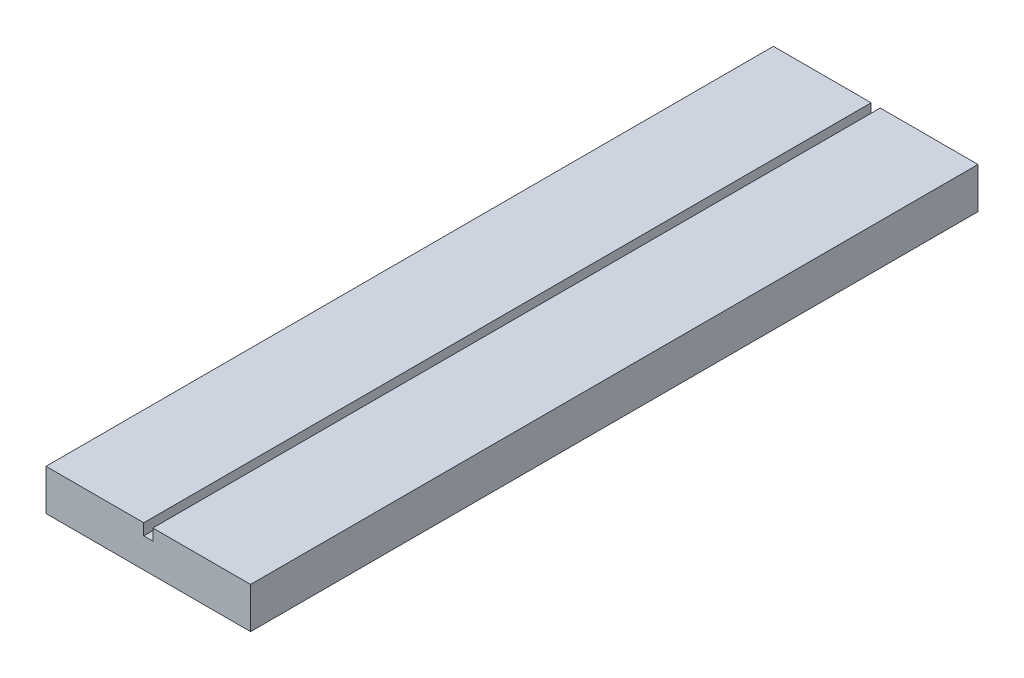
ISO-10303-21;
HEADER;
FILE_DESCRIPTION(('STEP AP214'),'2;1');
FILE_NAME('part.step','',(''),(''),'','','');
FILE_SCHEMA(('AUTOMOTIVE_DESIGN { 1 0 10303 214 1 1 1 1 }'));
ENDSEC;
DATA;
#1=APPLICATION_CONTEXT('core data for automotive mechanical design processes');
#2=APPLICATION_PROTOCOL_DEFINITION('international standard','automotive_design',2000,#1);
#3=PRODUCT_CONTEXT('',#1,'mechanical');
#4=PRODUCT('Part','Part','',(#3));
#5=PRODUCT_RELATED_PRODUCT_CATEGORY('part','',(#4));
#6=PRODUCT_DEFINITION_FORMATION('','',#4);
#7=PRODUCT_DEFINITION_CONTEXT('part definition',#1,'design');
#8=PRODUCT_DEFINITION('design','',#6,#7);
#9=PRODUCT_DEFINITION_SHAPE('','',#8);
#10=(LENGTH_UNIT() NAMED_UNIT(*) SI_UNIT(.MILLI.,.METRE.));
#11=(NAMED_UNIT(*) PLANE_ANGLE_UNIT() SI_UNIT($,.RADIAN.));
#12=(NAMED_UNIT(*) SI_UNIT($,.STERADIAN.) SOLID_ANGLE_UNIT());
#13=UNCERTAINTY_MEASURE_WITH_UNIT(LENGTH_MEASURE(1.E-05),#10,'distance_accuracy_value','');
#14=(GEOMETRIC_REPRESENTATION_CONTEXT(3) GLOBAL_UNCERTAINTY_ASSIGNED_CONTEXT((#13)) GLOBAL_UNIT_ASSIGNED_CONTEXT((#10,
#11,#12)) REPRESENTATION_CONTEXT('',''));
#15=CARTESIAN_POINT('',(0.,0.,0.));
#16=DIRECTION('',(0.,0.,1.));
#17=DIRECTION('',(1.,0.,0.));
#18=AXIS2_PLACEMENT_3D('',#15,#16,#17);
#19=CARTESIAN_POINT('',(0.,9.,0.));
#20=DIRECTION('',(0.,1.,0.));
#21=DIRECTION('',(0.,0.,1.));
#22=AXIS2_PLACEMENT_3D('',#19,#20,#21);
#23=PLANE('',#22);
#24=DIRECTION('',(1.,0.,0.));
#25=VECTOR('',#24,1.);
#26=CARTESIAN_POINT('',(-22.5,9.,80.0000000000001));
#27=LINE('',#26,#25);
#28=CARTESIAN_POINT('',(-22.5,9.,80.0000000000001));
#29=VERTEX_POINT('',#28);
#30=CARTESIAN_POINT('',(-1.,9.,80.0000000000001));
#31=VERTEX_POINT('',#30);
#32=EDGE_CURVE('E119',#29,#31,#27,.T.);
#33=ORIENTED_EDGE('',*,*,#32,.T.);
#34=DIRECTION('',(0.,0.,-1.));
#35=VECTOR('',#34,1.);
#36=CARTESIAN_POINT('',(-1.,9.,488.063992559982));
#37=LINE('',#36,#35);
#38=CARTESIAN_POINT('',(-1.00000000000001,9.,-79.9999999999999));
#39=VERTEX_POINT('',#38);
#40=EDGE_CURVE('E183',#31,#39,#37,.T.);
#41=ORIENTED_EDGE('',*,*,#40,.T.);
#42=DIRECTION('',(-1.,0.,0.));
#43=VECTOR('',#42,1.);
#44=CARTESIAN_POINT('',(-22.5,9.,-79.9999999999999));
#45=LINE('',#44,#43);
#46=CARTESIAN_POINT('',(-22.5,9.,-79.9999999999999));
#47=VERTEX_POINT('',#46);
#48=EDGE_CURVE('E173',#39,#47,#45,.T.);
#49=ORIENTED_EDGE('',*,*,#48,.T.);
#50=DIRECTION('',(0.,0.,1.));
#51=VECTOR('',#50,1.);
#52=CARTESIAN_POINT('',(-22.5,9.,-79.9999999999999));
#53=LINE('',#52,#51);
#54=EDGE_CURVE('E120',#47,#29,#53,.T.);
#55=ORIENTED_EDGE('',*,*,#54,.T.);
#56=EDGE_LOOP('',(#33,#41,#49,#55));
#57=FACE_BOUND('',#56,.T.);
#58=ADVANCED_FACE('F43',(#57),#23,.T.);
#59=CARTESIAN_POINT('',(-22.5,9.,-79.9999999999999));
#60=DIRECTION('',(0.,0.,1.));
#61=DIRECTION('',(1.,0.,0.));
#62=AXIS2_PLACEMENT_3D('',#59,#60,#61);
#63=PLANE('',#62);
#64=DIRECTION('',(0.,1.,0.));
#65=VECTOR('',#64,1.);
#66=CARTESIAN_POINT('',(-1.,9.,-79.9999999999999));
#67=LINE('',#66,#65);
#68=CARTESIAN_POINT('',(-0.999999999999997,6.5,-79.9999999999999));
#69=VERTEX_POINT('',#68);
#70=EDGE_CURVE('E59',#69,#39,#67,.T.);
#71=ORIENTED_EDGE('',*,*,#70,.F.);
#72=DIRECTION('',(-1.,0.,0.));
#73=VECTOR('',#72,1.);
#74=CARTESIAN_POINT('',(-22.5,6.5,-79.9999999999999));
#75=LINE('',#74,#73);
#76=CARTESIAN_POINT('',(1.,6.5,-79.9999999999999));
#77=VERTEX_POINT('',#76);
#78=EDGE_CURVE('E63',#77,#69,#75,.T.);
#79=ORIENTED_EDGE('',*,*,#78,.F.);
#80=DIRECTION('',(0.,-1.,0.));
#81=VECTOR('',#80,1.);
#82=CARTESIAN_POINT('',(1.,9.,-79.9999999999999));
#83=LINE('',#82,#81);
#84=CARTESIAN_POINT('',(0.999999999999994,9.,-79.9999999999999));
#85=VERTEX_POINT('',#84);
#86=EDGE_CURVE('E180',#85,#77,#83,.T.);
#87=ORIENTED_EDGE('',*,*,#86,.F.);
#88=CARTESIAN_POINT('',(22.5,9.,-79.9999999999999));
#89=VERTEX_POINT('',#88);
#90=EDGE_CURVE('E126',#89,#85,#45,.T.);
#91=ORIENTED_EDGE('',*,*,#90,.F.);
#92=DIRECTION('',(0.,-1.,0.));
#93=VECTOR('',#92,1.);
#94=CARTESIAN_POINT('',(22.5,9.,-79.9999999999999));
#95=LINE('',#94,#93);
#96=CARTESIAN_POINT('',(22.5,0.,-79.9999999999999));
#97=VERTEX_POINT('',#96);
#98=EDGE_CURVE('E136',#89,#97,#95,.T.);
#99=ORIENTED_EDGE('',*,*,#98,.T.);
#100=DIRECTION('',(-1.,0.,0.));
#101=VECTOR('',#100,1.);
#102=CARTESIAN_POINT('',(-22.5,0.,-79.9999999999999));
#103=LINE('',#102,#101);
#104=CARTESIAN_POINT('',(-22.5,0.,-79.9999999999999));
#105=VERTEX_POINT('',#104);
#106=EDGE_CURVE('E160',#97,#105,#103,.T.);
#107=ORIENTED_EDGE('',*,*,#106,.T.);
#108=DIRECTION('',(0.,-1.,0.));
#109=VECTOR('',#108,1.);
#110=CARTESIAN_POINT('',(-22.5,9.,-79.9999999999999));
#111=LINE('',#110,#109);
#112=EDGE_CURVE('E141',#47,#105,#111,.T.);
#113=ORIENTED_EDGE('',*,*,#112,.F.);
#114=ORIENTED_EDGE('',*,*,#48,.F.);
#115=EDGE_LOOP('',(#71,#79,#87,#91,#99,#107,#113,#114));
#116=FACE_BOUND('',#115,.T.);
#117=ADVANCED_FACE('F199',(#116),#63,.F.);
#118=CARTESIAN_POINT('',(-22.5,9.,80.0000000000001));
#119=DIRECTION('',(0.,0.,-1.));
#120=DIRECTION('',(-1.,0.,0.));
#121=AXIS2_PLACEMENT_3D('',#118,#119,#120);
#122=PLANE('',#121);
#123=DIRECTION('',(0.,-1.,0.));
#124=VECTOR('',#123,1.);
#125=CARTESIAN_POINT('',(-1.,9.,80.0000000000001));
#126=LINE('',#125,#124);
#127=CARTESIAN_POINT('',(-0.999999999999997,6.5,80.0000000000001));
#128=VERTEX_POINT('',#127);
#129=EDGE_CURVE('E11',#31,#128,#126,.T.);
#130=ORIENTED_EDGE('',*,*,#129,.F.);
#131=ORIENTED_EDGE('',*,*,#32,.F.);
#132=DIRECTION('',(0.,-1.,0.));
#133=VECTOR('',#132,1.);
#134=CARTESIAN_POINT('',(-22.5,9.,80.0000000000001));
#135=LINE('',#134,#133);
#136=CARTESIAN_POINT('',(-22.5,0.,80.0000000000001));
#137=VERTEX_POINT('',#136);
#138=EDGE_CURVE('E147',#29,#137,#135,.T.);
#139=ORIENTED_EDGE('',*,*,#138,.T.);
#140=DIRECTION('',(1.,0.,0.));
#141=VECTOR('',#140,1.);
#142=CARTESIAN_POINT('',(-22.5,0.,80.0000000000001));
#143=LINE('',#142,#141);
#144=CARTESIAN_POINT('',(22.5,0.,80.0000000000001));
#145=VERTEX_POINT('',#144);
#146=EDGE_CURVE('E153',#137,#145,#143,.T.);
#147=ORIENTED_EDGE('',*,*,#146,.T.);
#148=DIRECTION('',(0.,-1.,0.));
#149=VECTOR('',#148,1.);
#150=CARTESIAN_POINT('',(22.5,9.,80.0000000000001));
#151=LINE('',#150,#149);
#152=CARTESIAN_POINT('',(22.5,9.,80.0000000000001));
#153=VERTEX_POINT('',#152);
#154=EDGE_CURVE('E114',#153,#145,#151,.T.);
#155=ORIENTED_EDGE('',*,*,#154,.F.);
#156=CARTESIAN_POINT('',(1.,9.,80.0000000000001));
#157=VERTEX_POINT('',#156);
#158=EDGE_CURVE('E107',#157,#153,#27,.T.);
#159=ORIENTED_EDGE('',*,*,#158,.F.);
#160=DIRECTION('',(0.,1.,0.));
#161=VECTOR('',#160,1.);
#162=CARTESIAN_POINT('',(1.,9.,80.0000000000001));
#163=LINE('',#162,#161);
#164=CARTESIAN_POINT('',(1.,6.5,80.0000000000001));
#165=VERTEX_POINT('',#164);
#166=EDGE_CURVE('E111',#165,#157,#163,.T.);
#167=ORIENTED_EDGE('',*,*,#166,.F.);
#168=DIRECTION('',(1.,0.,0.));
#169=VECTOR('',#168,1.);
#170=CARTESIAN_POINT('',(-22.5,6.5,80.0000000000001));
#171=LINE('',#170,#169);
#172=EDGE_CURVE('E52',#128,#165,#171,.T.);
#173=ORIENTED_EDGE('',*,*,#172,.F.);
#174=EDGE_LOOP('',(#130,#131,#139,#147,#155,#159,#167,#173));
#175=FACE_BOUND('',#174,.T.);
#176=ADVANCED_FACE('F109',(#175),#122,.F.);
#177=CARTESIAN_POINT('',(22.5,9.,-79.9999999999999));
#178=DIRECTION('',(-1.,0.,0.));
#179=DIRECTION('',(0.,0.,1.));
#180=AXIS2_PLACEMENT_3D('',#177,#178,#179);
#181=PLANE('',#180);
#182=DIRECTION('',(0.,0.,-1.));
#183=VECTOR('',#182,1.);
#184=CARTESIAN_POINT('',(22.5,0.,-79.9999999999999));
#185=LINE('',#184,#183);
#186=EDGE_CURVE('E163',#145,#97,#185,.T.);
#187=ORIENTED_EDGE('',*,*,#186,.T.);
#188=ORIENTED_EDGE('',*,*,#98,.F.);
#189=DIRECTION('',(0.,0.,-1.));
#190=VECTOR('',#189,1.);
#191=CARTESIAN_POINT('',(22.5,9.,-79.9999999999999));
#192=LINE('',#191,#190);
#193=EDGE_CURVE('E156',#153,#89,#192,.T.);
#194=ORIENTED_EDGE('',*,*,#193,.F.);
#195=ORIENTED_EDGE('',*,*,#154,.T.);
#196=EDGE_LOOP('',(#187,#188,#194,#195));
#197=FACE_BOUND('',#196,.T.);
#198=ADVANCED_FACE('F45',(#197),#181,.F.);
#199=CARTESIAN_POINT('',(-22.5,9.,-79.9999999999999));
#200=DIRECTION('',(1.,0.,0.));
#201=DIRECTION('',(0.,0.,-1.));
#202=AXIS2_PLACEMENT_3D('',#199,#200,#201);
#203=PLANE('',#202);
#204=DIRECTION('',(0.,0.,1.));
#205=VECTOR('',#204,1.);
#206=CARTESIAN_POINT('',(-22.5,0.,-79.9999999999999));
#207=LINE('',#206,#205);
#208=EDGE_CURVE('E157',#105,#137,#207,.T.);
#209=ORIENTED_EDGE('',*,*,#208,.T.);
#210=ORIENTED_EDGE('',*,*,#138,.F.);
#211=ORIENTED_EDGE('',*,*,#54,.F.);
#212=ORIENTED_EDGE('',*,*,#112,.T.);
#213=EDGE_LOOP('',(#209,#210,#211,#212));
#214=FACE_BOUND('',#213,.T.);
#215=ADVANCED_FACE('F205',(#214),#203,.F.);
#216=DIRECTION('',(0.,0.,-1.));
#217=VECTOR('',#216,1.);
#218=CARTESIAN_POINT('',(1.,9.,488.063992559982));
#219=LINE('',#218,#217);
#220=EDGE_CURVE('E124',#157,#85,#219,.T.);
#221=ORIENTED_EDGE('',*,*,#220,.F.);
#222=ORIENTED_EDGE('',*,*,#158,.T.);
#223=ORIENTED_EDGE('',*,*,#193,.T.);
#224=ORIENTED_EDGE('',*,*,#90,.T.);
#225=EDGE_LOOP('',(#221,#222,#223,#224));
#226=FACE_BOUND('',#225,.T.);
#227=ADVANCED_FACE('F125',(#226),#23,.T.);
#228=CARTESIAN_POINT('',(0.,0.,0.));
#229=DIRECTION('',(0.,1.,0.));
#230=DIRECTION('',(0.,0.,1.));
#231=AXIS2_PLACEMENT_3D('',#228,#229,#230);
#232=PLANE('',#231);
#233=ORIENTED_EDGE('',*,*,#186,.F.);
#234=ORIENTED_EDGE('',*,*,#146,.F.);
#235=ORIENTED_EDGE('',*,*,#208,.F.);
#236=ORIENTED_EDGE('',*,*,#106,.F.);
#237=EDGE_LOOP('',(#233,#234,#235,#236));
#238=FACE_BOUND('',#237,.T.);
#239=ADVANCED_FACE('F209',(#238),#232,.F.);
#240=CARTESIAN_POINT('',(-1.,6.5,488.063992559982));
#241=DIRECTION('',(1.,0.,0.));
#242=DIRECTION('',(0.,0.,-1.));
#243=AXIS2_PLACEMENT_3D('',#240,#241,#242);
#244=PLANE('',#243);
#245=DIRECTION('',(0.,0.,-1.));
#246=VECTOR('',#245,1.);
#247=CARTESIAN_POINT('',(-1.,6.5,488.063992559982));
#248=LINE('',#247,#246);
#249=EDGE_CURVE('E129',#128,#69,#248,.T.);
#250=ORIENTED_EDGE('',*,*,#249,.T.);
#251=ORIENTED_EDGE('',*,*,#70,.T.);
#252=ORIENTED_EDGE('',*,*,#40,.F.);
#253=ORIENTED_EDGE('',*,*,#129,.T.);
#254=EDGE_LOOP('',(#250,#251,#252,#253));
#255=FACE_BOUND('',#254,.T.);
#256=ADVANCED_FACE('F196',(#255),#244,.T.);
#257=CARTESIAN_POINT('',(-1.,6.5,488.063992559982));
#258=DIRECTION('',(0.,1.,0.));
#259=DIRECTION('',(0.,0.,1.));
#260=AXIS2_PLACEMENT_3D('',#257,#258,#259);
#261=PLANE('',#260);
#262=DIRECTION('',(0.,0.,-1.));
#263=VECTOR('',#262,1.);
#264=CARTESIAN_POINT('',(1.,6.5,488.063992559982));
#265=LINE('',#264,#263);
#266=EDGE_CURVE('E130',#165,#77,#265,.T.);
#267=ORIENTED_EDGE('',*,*,#266,.T.);
#268=ORIENTED_EDGE('',*,*,#78,.T.);
#269=ORIENTED_EDGE('',*,*,#249,.F.);
#270=ORIENTED_EDGE('',*,*,#172,.T.);
#271=EDGE_LOOP('',(#267,#268,#269,#270));
#272=FACE_BOUND('',#271,.T.);
#273=ADVANCED_FACE('F191',(#272),#261,.T.);
#274=CARTESIAN_POINT('',(1.,6.5,488.063992559982));
#275=DIRECTION('',(-1.,0.,0.));
#276=DIRECTION('',(0.,-1.,0.));
#277=AXIS2_PLACEMENT_3D('',#274,#275,#276);
#278=PLANE('',#277);
#279=ORIENTED_EDGE('',*,*,#220,.T.);
#280=ORIENTED_EDGE('',*,*,#86,.T.);
#281=ORIENTED_EDGE('',*,*,#266,.F.);
#282=ORIENTED_EDGE('',*,*,#166,.T.);
#283=EDGE_LOOP('',(#279,#280,#281,#282));
#284=FACE_BOUND('',#283,.T.);
#285=ADVANCED_FACE('F133',(#284),#278,.T.);
#286=CLOSED_SHELL('',(#58,#117,#176,#198,#215,#227,#239,#256,#273,#285));
#287=MANIFOLD_SOLID_BREP('B2',#286);
#288=ADVANCED_BREP_SHAPE_REPRESENTATION('',(#18,#287),#14);
#289=SHAPE_DEFINITION_REPRESENTATION(#9,#288);
ENDSEC;
END-ISO-10303-21;
